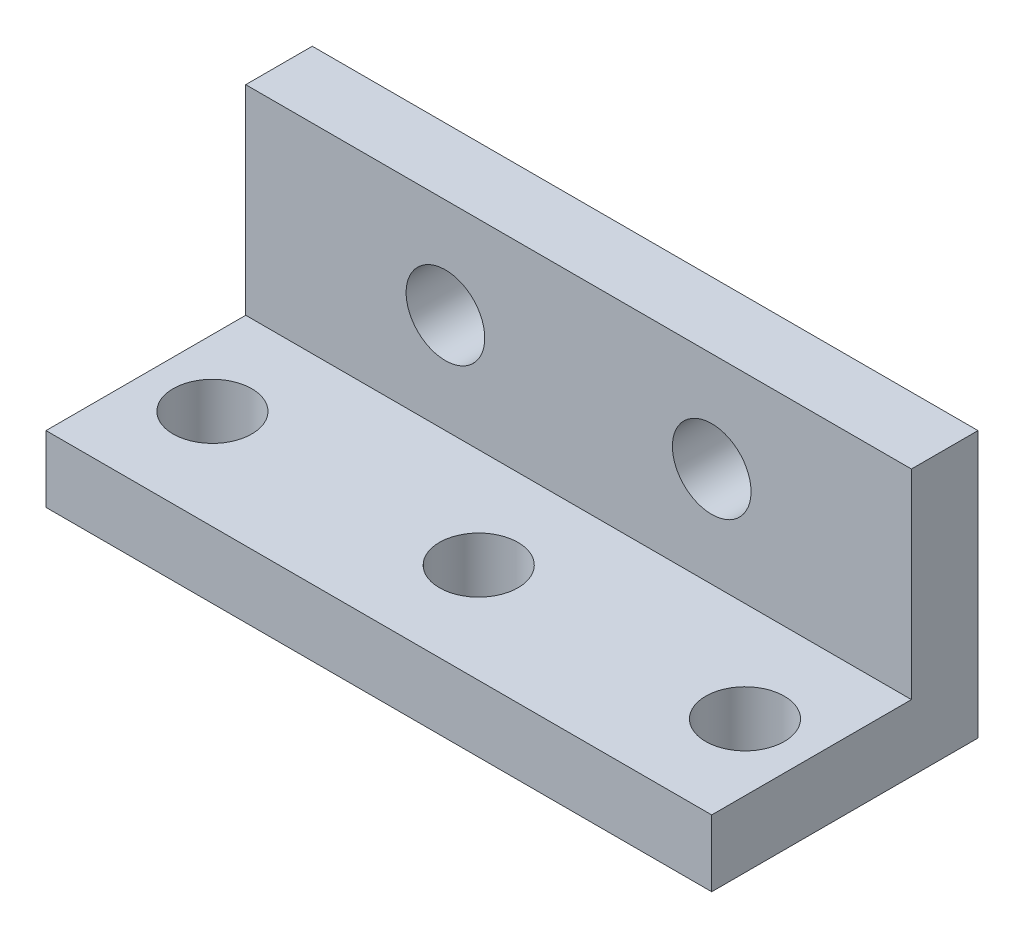
ISO-10303-21;
HEADER;
FILE_DESCRIPTION(('STEP AP214'),'2;1');
FILE_NAME('part.step','',(''),(''),'','','');
FILE_SCHEMA(('AUTOMOTIVE_DESIGN { 1 0 10303 214 1 1 1 1 }'));
ENDSEC;
DATA;
#1=APPLICATION_CONTEXT('core data for automotive mechanical design processes');
#2=APPLICATION_PROTOCOL_DEFINITION('international standard','automotive_design',2000,#1);
#3=PRODUCT_CONTEXT('',#1,'mechanical');
#4=PRODUCT('Part','Part','',(#3));
#5=PRODUCT_RELATED_PRODUCT_CATEGORY('part','',(#4));
#6=PRODUCT_DEFINITION_FORMATION('','',#4);
#7=PRODUCT_DEFINITION_CONTEXT('part definition',#1,'design');
#8=PRODUCT_DEFINITION('design','',#6,#7);
#9=PRODUCT_DEFINITION_SHAPE('','',#8);
#10=(LENGTH_UNIT() NAMED_UNIT(*) SI_UNIT(.MILLI.,.METRE.));
#11=(NAMED_UNIT(*) PLANE_ANGLE_UNIT() SI_UNIT($,.RADIAN.));
#12=(NAMED_UNIT(*) SI_UNIT($,.STERADIAN.) SOLID_ANGLE_UNIT());
#13=UNCERTAINTY_MEASURE_WITH_UNIT(LENGTH_MEASURE(1.E-05),#10,'distance_accuracy_value','');
#14=(GEOMETRIC_REPRESENTATION_CONTEXT(3) GLOBAL_UNCERTAINTY_ASSIGNED_CONTEXT((#13)) GLOBAL_UNIT_ASSIGNED_CONTEXT((#10,
#11,#12)) REPRESENTATION_CONTEXT('',''));
#15=CARTESIAN_POINT('',(0.,0.,0.));
#16=DIRECTION('',(0.,0.,1.));
#17=DIRECTION('',(1.,0.,0.));
#18=AXIS2_PLACEMENT_3D('',#15,#16,#17);
#19=CARTESIAN_POINT('',(25.4,0.,0.));
#20=DIRECTION('',(0.,0.,-1.));
#21=DIRECTION('',(-1.,0.,0.));
#22=AXIS2_PLACEMENT_3D('',#19,#20,#21);
#23=PLANE('',#22);
#24=DIRECTION('',(0.,-1.,0.));
#25=VECTOR('',#24,1.);
#26=CARTESIAN_POINT('',(25.4,0.,0.));
#27=LINE('',#26,#25);
#28=CARTESIAN_POINT('',(25.4,2.54,0.));
#29=VERTEX_POINT('',#28);
#30=CARTESIAN_POINT('',(25.4,0.,0.));
#31=VERTEX_POINT('',#30);
#32=EDGE_CURVE('E84',#29,#31,#27,.T.);
#33=ORIENTED_EDGE('',*,*,#32,.F.);
#34=DIRECTION('',(1.,0.,0.));
#35=VECTOR('',#34,1.);
#36=CARTESIAN_POINT('',(0.,2.54,0.));
#37=LINE('',#36,#35);
#38=CARTESIAN_POINT('',(0.,2.54,0.));
#39=VERTEX_POINT('',#38);
#40=EDGE_CURVE('E104',#39,#29,#37,.T.);
#41=ORIENTED_EDGE('',*,*,#40,.F.);
#42=DIRECTION('',(0.,-1.,0.));
#43=VECTOR('',#42,1.);
#44=CARTESIAN_POINT('',(0.,0.,0.));
#45=LINE('',#44,#43);
#46=CARTESIAN_POINT('',(0.,0.,0.));
#47=VERTEX_POINT('',#46);
#48=EDGE_CURVE('E113',#39,#47,#45,.T.);
#49=ORIENTED_EDGE('',*,*,#48,.T.);
#50=DIRECTION('',(-1.,0.,0.));
#51=VECTOR('',#50,1.);
#52=CARTESIAN_POINT('',(25.4,0.,0.));
#53=LINE('',#52,#51);
#54=EDGE_CURVE('E11',#31,#47,#53,.T.);
#55=ORIENTED_EDGE('',*,*,#54,.F.);
#56=EDGE_LOOP('',(#33,#41,#49,#55));
#57=FACE_BOUND('',#56,.T.);
#58=ADVANCED_FACE('F38',(#57),#23,.F.);
#59=CARTESIAN_POINT('',(25.4,0.,0.));
#60=DIRECTION('',(0.,1.,0.));
#61=DIRECTION('',(0.,0.,1.));
#62=AXIS2_PLACEMENT_3D('',#59,#60,#61);
#63=PLANE('',#62);
#64=CARTESIAN_POINT('',(2.54,0.,-3.81));
#65=DIRECTION('',(0.,1.,0.));
#66=DIRECTION('',(0.,0.,1.));
#67=AXIS2_PLACEMENT_3D('',#64,#65,#66);
#68=CIRCLE('',#67,1.5);
#69=CARTESIAN_POINT('',(2.54,0.,-2.31));
#70=VERTEX_POINT('',#69);
#71=EDGE_CURVE('E171',#70,#70,#68,.T.);
#72=ORIENTED_EDGE('',*,*,#71,.T.);
#73=EDGE_LOOP('',(#72));
#74=FACE_BOUND('',#73,.T.);
#75=CARTESIAN_POINT('',(22.86,0.,-3.81));
#76=DIRECTION('',(0.,1.,0.));
#77=DIRECTION('',(0.,0.,1.));
#78=AXIS2_PLACEMENT_3D('',#75,#76,#77);
#79=CIRCLE('',#78,1.5);
#80=CARTESIAN_POINT('',(22.86,0.,-2.31));
#81=VERTEX_POINT('',#80);
#82=EDGE_CURVE('E194',#81,#81,#79,.T.);
#83=ORIENTED_EDGE('',*,*,#82,.T.);
#84=EDGE_LOOP('',(#83));
#85=FACE_BOUND('',#84,.T.);
#86=CARTESIAN_POINT('',(12.7,0.,-3.81));
#87=DIRECTION('',(0.,1.,0.));
#88=DIRECTION('',(0.,0.,1.));
#89=AXIS2_PLACEMENT_3D('',#86,#87,#88);
#90=CIRCLE('',#89,1.5);
#91=CARTESIAN_POINT('',(12.7,0.,-2.31));
#92=VERTEX_POINT('',#91);
#93=EDGE_CURVE('E186',#92,#92,#90,.T.);
#94=ORIENTED_EDGE('',*,*,#93,.T.);
#95=EDGE_LOOP('',(#94));
#96=FACE_BOUND('',#95,.T.);
#97=DIRECTION('',(0.,0.,-1.));
#98=VECTOR('',#97,1.);
#99=CARTESIAN_POINT('',(0.,0.,0.));
#100=LINE('',#99,#98);
#101=CARTESIAN_POINT('',(0.,0.,-10.16));
#102=VERTEX_POINT('',#101);
#103=EDGE_CURVE('E118',#47,#102,#100,.T.);
#104=ORIENTED_EDGE('',*,*,#103,.T.);
#105=DIRECTION('',(-1.,0.,0.));
#106=VECTOR('',#105,1.);
#107=CARTESIAN_POINT('',(25.4,0.,-10.16));
#108=LINE('',#107,#106);
#109=CARTESIAN_POINT('',(25.4,0.,-10.16));
#110=VERTEX_POINT('',#109);
#111=EDGE_CURVE('E46',#110,#102,#108,.T.);
#112=ORIENTED_EDGE('',*,*,#111,.F.);
#113=DIRECTION('',(0.,0.,-1.));
#114=VECTOR('',#113,1.);
#115=CARTESIAN_POINT('',(25.4,0.,0.));
#116=LINE('',#115,#114);
#117=EDGE_CURVE('E150',#31,#110,#116,.T.);
#118=ORIENTED_EDGE('',*,*,#117,.F.);
#119=ORIENTED_EDGE('',*,*,#54,.T.);
#120=EDGE_LOOP('',(#104,#112,#118,#119));
#121=FACE_BOUND('',#120,.T.);
#122=ADVANCED_FACE('F206',(#74,#85,#96,#121),#63,.F.);
#123=CARTESIAN_POINT('',(25.4,0.,-10.16));
#124=DIRECTION('',(0.,0.,1.));
#125=DIRECTION('',(1.,0.,0.));
#126=AXIS2_PLACEMENT_3D('',#123,#124,#125);
#127=PLANE('',#126);
#128=CARTESIAN_POINT('',(7.62,6.35,-10.16));
#129=DIRECTION('',(0.,0.,1.));
#130=DIRECTION('',(1.,0.,0.));
#131=AXIS2_PLACEMENT_3D('',#128,#129,#130);
#132=CIRCLE('',#131,1.5);
#133=CARTESIAN_POINT('',(9.12,6.35,-10.16));
#134=VERTEX_POINT('',#133);
#135=EDGE_CURVE('E163',#134,#134,#132,.T.);
#136=ORIENTED_EDGE('',*,*,#135,.T.);
#137=EDGE_LOOP('',(#136));
#138=FACE_BOUND('',#137,.T.);
#139=CARTESIAN_POINT('',(17.78,6.35,-10.16));
#140=DIRECTION('',(0.,0.,1.));
#141=DIRECTION('',(1.,0.,0.));
#142=AXIS2_PLACEMENT_3D('',#139,#140,#141);
#143=CIRCLE('',#142,1.5);
#144=CARTESIAN_POINT('',(19.28,6.35,-10.16));
#145=VERTEX_POINT('',#144);
#146=EDGE_CURVE('E170',#145,#145,#143,.T.);
#147=ORIENTED_EDGE('',*,*,#146,.T.);
#148=EDGE_LOOP('',(#147));
#149=FACE_BOUND('',#148,.T.);
#150=DIRECTION('',(0.,1.,0.));
#151=VECTOR('',#150,1.);
#152=CARTESIAN_POINT('',(0.,0.,-10.16));
#153=LINE('',#152,#151);
#154=CARTESIAN_POINT('',(0.,10.16,-10.16));
#155=VERTEX_POINT('',#154);
#156=EDGE_CURVE('E79',#102,#155,#153,.T.);
#157=ORIENTED_EDGE('',*,*,#156,.T.);
#158=DIRECTION('',(-1.,0.,0.));
#159=VECTOR('',#158,1.);
#160=CARTESIAN_POINT('',(25.4,10.16,-10.16));
#161=LINE('',#160,#159);
#162=CARTESIAN_POINT('',(25.4,10.16,-10.16));
#163=VERTEX_POINT('',#162);
#164=EDGE_CURVE('E137',#163,#155,#161,.T.);
#165=ORIENTED_EDGE('',*,*,#164,.F.);
#166=DIRECTION('',(0.,1.,0.));
#167=VECTOR('',#166,1.);
#168=CARTESIAN_POINT('',(25.4,0.,-10.16));
#169=LINE('',#168,#167);
#170=EDGE_CURVE('E62',#110,#163,#169,.T.);
#171=ORIENTED_EDGE('',*,*,#170,.F.);
#172=ORIENTED_EDGE('',*,*,#111,.T.);
#173=EDGE_LOOP('',(#157,#165,#171,#172));
#174=FACE_BOUND('',#173,.T.);
#175=ADVANCED_FACE('F141',(#138,#149,#174),#127,.F.);
#176=CARTESIAN_POINT('',(25.4,10.16,0.));
#177=DIRECTION('',(0.,-1.,0.));
#178=DIRECTION('',(0.,0.,-1.));
#179=AXIS2_PLACEMENT_3D('',#176,#177,#178);
#180=PLANE('',#179);
#181=DIRECTION('',(0.,0.,1.));
#182=VECTOR('',#181,1.);
#183=CARTESIAN_POINT('',(0.,10.16,0.));
#184=LINE('',#183,#182);
#185=CARTESIAN_POINT('',(0.,10.16,-7.62));
#186=VERTEX_POINT('',#185);
#187=EDGE_CURVE('E133',#155,#186,#184,.T.);
#188=ORIENTED_EDGE('',*,*,#187,.T.);
#189=DIRECTION('',(1.,0.,0.));
#190=VECTOR('',#189,1.);
#191=CARTESIAN_POINT('',(0.,10.16,-7.62));
#192=LINE('',#191,#190);
#193=CARTESIAN_POINT('',(25.4,10.16,-7.62));
#194=VERTEX_POINT('',#193);
#195=EDGE_CURVE('E120',#186,#194,#192,.T.);
#196=ORIENTED_EDGE('',*,*,#195,.T.);
#197=DIRECTION('',(0.,0.,1.));
#198=VECTOR('',#197,1.);
#199=CARTESIAN_POINT('',(25.4,10.16,0.));
#200=LINE('',#199,#198);
#201=EDGE_CURVE('E128',#163,#194,#200,.T.);
#202=ORIENTED_EDGE('',*,*,#201,.F.);
#203=ORIENTED_EDGE('',*,*,#164,.T.);
#204=EDGE_LOOP('',(#188,#196,#202,#203));
#205=FACE_BOUND('',#204,.T.);
#206=ADVANCED_FACE('F145',(#205),#180,.F.);
#207=CARTESIAN_POINT('',(25.4,0.,0.));
#208=DIRECTION('',(-1.,0.,0.));
#209=DIRECTION('',(0.,0.,1.));
#210=AXIS2_PLACEMENT_3D('',#207,#208,#209);
#211=PLANE('',#210);
#212=ORIENTED_EDGE('',*,*,#201,.T.);
#213=DIRECTION('',(0.,1.,0.));
#214=VECTOR('',#213,1.);
#215=CARTESIAN_POINT('',(25.4,10.16,-7.62));
#216=LINE('',#215,#214);
#217=CARTESIAN_POINT('',(25.4,2.54,-7.62));
#218=VERTEX_POINT('',#217);
#219=EDGE_CURVE('E109',#218,#194,#216,.T.);
#220=ORIENTED_EDGE('',*,*,#219,.F.);
#221=DIRECTION('',(0.,0.,-1.));
#222=VECTOR('',#221,1.);
#223=CARTESIAN_POINT('',(25.4,2.54,0.));
#224=LINE('',#223,#222);
#225=EDGE_CURVE('E160',#29,#218,#224,.T.);
#226=ORIENTED_EDGE('',*,*,#225,.F.);
#227=ORIENTED_EDGE('',*,*,#32,.T.);
#228=ORIENTED_EDGE('',*,*,#117,.T.);
#229=ORIENTED_EDGE('',*,*,#170,.T.);
#230=EDGE_LOOP('',(#212,#220,#226,#227,#228,#229));
#231=FACE_BOUND('',#230,.T.);
#232=ADVANCED_FACE('F252',(#231),#211,.F.);
#233=CARTESIAN_POINT('',(0.,0.,0.));
#234=DIRECTION('',(-1.,0.,0.));
#235=DIRECTION('',(0.,0.,1.));
#236=AXIS2_PLACEMENT_3D('',#233,#234,#235);
#237=PLANE('',#236);
#238=DIRECTION('',(0.,1.,0.));
#239=VECTOR('',#238,1.);
#240=CARTESIAN_POINT('',(0.,10.16,-7.62));
#241=LINE('',#240,#239);
#242=CARTESIAN_POINT('',(0.,2.54,-7.62));
#243=VERTEX_POINT('',#242);
#244=EDGE_CURVE('E53',#243,#186,#241,.T.);
#245=ORIENTED_EDGE('',*,*,#244,.T.);
#246=ORIENTED_EDGE('',*,*,#187,.F.);
#247=ORIENTED_EDGE('',*,*,#156,.F.);
#248=ORIENTED_EDGE('',*,*,#103,.F.);
#249=ORIENTED_EDGE('',*,*,#48,.F.);
#250=DIRECTION('',(0.,0.,-1.));
#251=VECTOR('',#250,1.);
#252=CARTESIAN_POINT('',(0.,2.54,0.));
#253=LINE('',#252,#251);
#254=EDGE_CURVE('E100',#39,#243,#253,.T.);
#255=ORIENTED_EDGE('',*,*,#254,.T.);
#256=EDGE_LOOP('',(#245,#246,#247,#248,#249,#255));
#257=FACE_BOUND('',#256,.T.);
#258=ADVANCED_FACE('F117',(#257),#237,.T.);
#259=CARTESIAN_POINT('',(0.,10.16,-7.62));
#260=DIRECTION('',(0.,0.,-1.));
#261=DIRECTION('',(0.,1.,0.));
#262=AXIS2_PLACEMENT_3D('',#259,#260,#261);
#263=PLANE('',#262);
#264=CARTESIAN_POINT('',(7.62,6.35,-7.62));
#265=DIRECTION('',(0.,0.,1.));
#266=DIRECTION('',(1.,0.,0.));
#267=AXIS2_PLACEMENT_3D('',#264,#265,#266);
#268=CIRCLE('',#267,1.5);
#269=CARTESIAN_POINT('',(9.12,6.35,-7.62));
#270=VERTEX_POINT('',#269);
#271=EDGE_CURVE('E175',#270,#270,#268,.T.);
#272=ORIENTED_EDGE('',*,*,#271,.F.);
#273=EDGE_LOOP('',(#272));
#274=FACE_BOUND('',#273,.T.);
#275=CARTESIAN_POINT('',(17.78,6.35,-7.62));
#276=DIRECTION('',(0.,0.,1.));
#277=DIRECTION('',(1.,0.,0.));
#278=AXIS2_PLACEMENT_3D('',#275,#276,#277);
#279=CIRCLE('',#278,1.5);
#280=CARTESIAN_POINT('',(19.28,6.35,-7.62));
#281=VERTEX_POINT('',#280);
#282=EDGE_CURVE('E166',#281,#281,#279,.T.);
#283=ORIENTED_EDGE('',*,*,#282,.F.);
#284=EDGE_LOOP('',(#283));
#285=FACE_BOUND('',#284,.T.);
#286=ORIENTED_EDGE('',*,*,#219,.T.);
#287=ORIENTED_EDGE('',*,*,#195,.F.);
#288=ORIENTED_EDGE('',*,*,#244,.F.);
#289=DIRECTION('',(1.,0.,0.));
#290=VECTOR('',#289,1.);
#291=CARTESIAN_POINT('',(0.,2.54,-7.62));
#292=LINE('',#291,#290);
#293=EDGE_CURVE('E105',#243,#218,#292,.T.);
#294=ORIENTED_EDGE('',*,*,#293,.T.);
#295=EDGE_LOOP('',(#286,#287,#288,#294));
#296=FACE_BOUND('',#295,.T.);
#297=ADVANCED_FACE('F219',(#274,#285,#296),#263,.F.);
#298=CARTESIAN_POINT('',(0.,2.54,0.));
#299=DIRECTION('',(0.,-1.,0.));
#300=DIRECTION('',(0.,0.,-1.));
#301=AXIS2_PLACEMENT_3D('',#298,#299,#300);
#302=PLANE('',#301);
#303=CARTESIAN_POINT('',(2.54,2.54,-3.81));
#304=DIRECTION('',(0.,1.,0.));
#305=DIRECTION('',(0.,0.,1.));
#306=AXIS2_PLACEMENT_3D('',#303,#304,#305);
#307=CIRCLE('',#306,1.5);
#308=CARTESIAN_POINT('',(2.54,2.54,-2.31));
#309=VERTEX_POINT('',#308);
#310=EDGE_CURVE('E198',#309,#309,#307,.T.);
#311=ORIENTED_EDGE('',*,*,#310,.F.);
#312=EDGE_LOOP('',(#311));
#313=FACE_BOUND('',#312,.T.);
#314=CARTESIAN_POINT('',(22.86,2.54,-3.81));
#315=DIRECTION('',(0.,1.,0.));
#316=DIRECTION('',(0.,0.,1.));
#317=AXIS2_PLACEMENT_3D('',#314,#315,#316);
#318=CIRCLE('',#317,1.5);
#319=CARTESIAN_POINT('',(22.86,2.54,-2.31));
#320=VERTEX_POINT('',#319);
#321=EDGE_CURVE('E190',#320,#320,#318,.T.);
#322=ORIENTED_EDGE('',*,*,#321,.F.);
#323=EDGE_LOOP('',(#322));
#324=FACE_BOUND('',#323,.T.);
#325=CARTESIAN_POINT('',(12.7,2.54,-3.81));
#326=DIRECTION('',(0.,1.,0.));
#327=DIRECTION('',(0.,0.,1.));
#328=AXIS2_PLACEMENT_3D('',#325,#326,#327);
#329=CIRCLE('',#328,1.5);
#330=CARTESIAN_POINT('',(12.7,2.54,-2.31));
#331=VERTEX_POINT('',#330);
#332=EDGE_CURVE('E182',#331,#331,#329,.T.);
#333=ORIENTED_EDGE('',*,*,#332,.F.);
#334=EDGE_LOOP('',(#333));
#335=FACE_BOUND('',#334,.T.);
#336=ORIENTED_EDGE('',*,*,#225,.T.);
#337=ORIENTED_EDGE('',*,*,#293,.F.);
#338=ORIENTED_EDGE('',*,*,#254,.F.);
#339=ORIENTED_EDGE('',*,*,#40,.T.);
#340=EDGE_LOOP('',(#336,#337,#338,#339));
#341=FACE_BOUND('',#340,.T.);
#342=ADVANCED_FACE('F103',(#313,#324,#335,#341),#302,.F.);
#343=CARTESIAN_POINT('',(17.78,6.35,-10.16));
#344=DIRECTION('',(0.,0.,1.));
#345=DIRECTION('',(1.,0.,0.));
#346=AXIS2_PLACEMENT_3D('',#343,#344,#345);
#347=CYLINDRICAL_SURFACE('',#346,1.5);
#348=ORIENTED_EDGE('',*,*,#146,.F.);
#349=EDGE_LOOP('',(#348));
#350=FACE_BOUND('',#349,.T.);
#351=ORIENTED_EDGE('',*,*,#282,.T.);
#352=EDGE_LOOP('',(#351));
#353=FACE_BOUND('',#352,.T.);
#354=ADVANCED_FACE('F218',(#350,#353),#347,.F.);
#355=CARTESIAN_POINT('',(7.62,6.35,-10.16));
#356=DIRECTION('',(0.,0.,1.));
#357=DIRECTION('',(1.,0.,0.));
#358=AXIS2_PLACEMENT_3D('',#355,#356,#357);
#359=CYLINDRICAL_SURFACE('',#358,1.5);
#360=ORIENTED_EDGE('',*,*,#135,.F.);
#361=EDGE_LOOP('',(#360));
#362=FACE_BOUND('',#361,.T.);
#363=ORIENTED_EDGE('',*,*,#271,.T.);
#364=EDGE_LOOP('',(#363));
#365=FACE_BOUND('',#364,.T.);
#366=ADVANCED_FACE('F227',(#362,#365),#359,.F.);
#367=CARTESIAN_POINT('',(12.7,0.,-3.81));
#368=DIRECTION('',(0.,1.,0.));
#369=DIRECTION('',(0.,0.,1.));
#370=AXIS2_PLACEMENT_3D('',#367,#368,#369);
#371=CYLINDRICAL_SURFACE('',#370,1.5);
#372=ORIENTED_EDGE('',*,*,#93,.F.);
#373=EDGE_LOOP('',(#372));
#374=FACE_BOUND('',#373,.T.);
#375=ORIENTED_EDGE('',*,*,#332,.T.);
#376=EDGE_LOOP('',(#375));
#377=FACE_BOUND('',#376,.T.);
#378=ADVANCED_FACE('F225',(#374,#377),#371,.F.);
#379=CARTESIAN_POINT('',(22.86,0.,-3.81));
#380=DIRECTION('',(0.,1.,0.));
#381=DIRECTION('',(0.,0.,1.));
#382=AXIS2_PLACEMENT_3D('',#379,#380,#381);
#383=CYLINDRICAL_SURFACE('',#382,1.5);
#384=ORIENTED_EDGE('',*,*,#82,.F.);
#385=EDGE_LOOP('',(#384));
#386=FACE_BOUND('',#385,.T.);
#387=ORIENTED_EDGE('',*,*,#321,.T.);
#388=EDGE_LOOP('',(#387));
#389=FACE_BOUND('',#388,.T.);
#390=ADVANCED_FACE('F212',(#386,#389),#383,.F.);
#391=CARTESIAN_POINT('',(2.54,0.,-3.81));
#392=DIRECTION('',(0.,1.,0.));
#393=DIRECTION('',(0.,0.,1.));
#394=AXIS2_PLACEMENT_3D('',#391,#392,#393);
#395=CYLINDRICAL_SURFACE('',#394,1.5);
#396=ORIENTED_EDGE('',*,*,#71,.F.);
#397=EDGE_LOOP('',(#396));
#398=FACE_BOUND('',#397,.T.);
#399=ORIENTED_EDGE('',*,*,#310,.T.);
#400=EDGE_LOOP('',(#399));
#401=FACE_BOUND('',#400,.T.);
#402=ADVANCED_FACE('F209',(#398,#401),#395,.F.);
#403=CLOSED_SHELL('',(#58,#122,#175,#206,#232,#258,#297,#342,#354,#366,#378,#390,#402));
#404=MANIFOLD_SOLID_BREP('B2',#403);
#405=ADVANCED_BREP_SHAPE_REPRESENTATION('',(#18,#404),#14);
#406=SHAPE_DEFINITION_REPRESENTATION(#9,#405);
ENDSEC;
END-ISO-10303-21;
